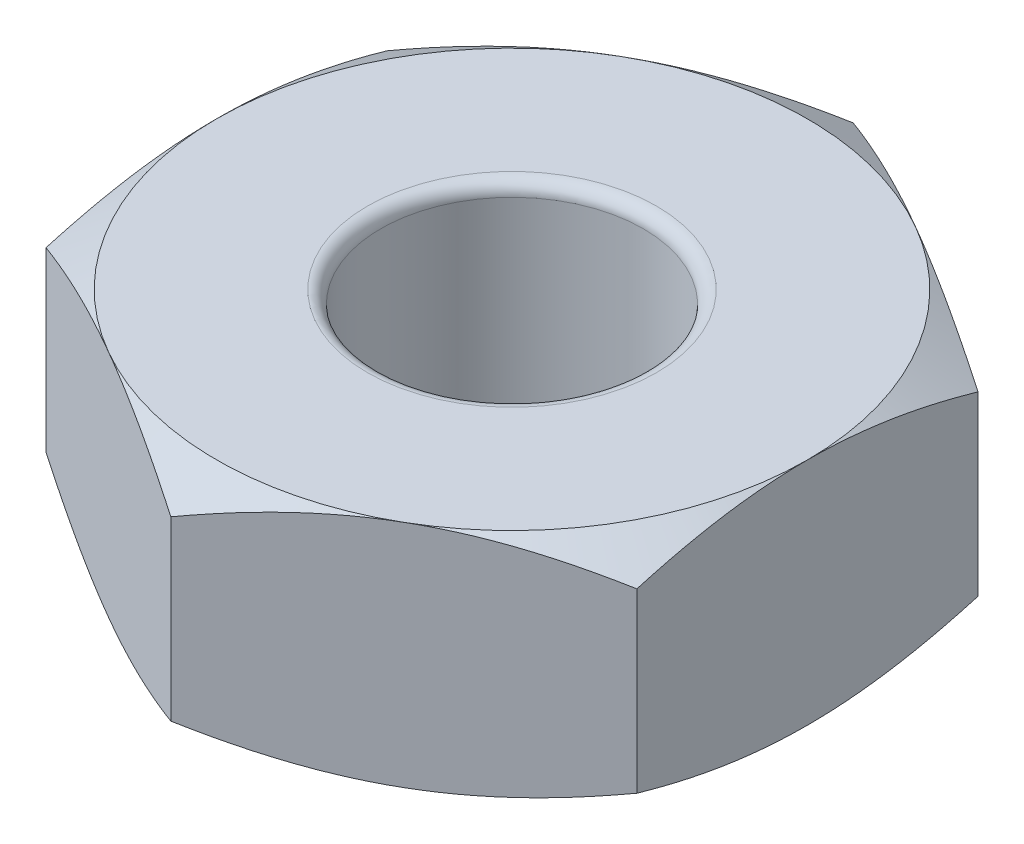
ISO-10303-21;
HEADER;
FILE_DESCRIPTION(('STEP AP214'),'2;1');
FILE_NAME('part.step','',(''),(''),'','','');
FILE_SCHEMA(('AUTOMOTIVE_DESIGN { 1 0 10303 214 1 1 1 1 }'));
ENDSEC;
DATA;
#1=APPLICATION_CONTEXT('core data for automotive mechanical design processes');
#2=APPLICATION_PROTOCOL_DEFINITION('international standard','automotive_design',2000,#1);
#3=PRODUCT_CONTEXT('',#1,'mechanical');
#4=PRODUCT('Part','Part','',(#3));
#5=PRODUCT_RELATED_PRODUCT_CATEGORY('part','',(#4));
#6=PRODUCT_DEFINITION_FORMATION('','',#4);
#7=PRODUCT_DEFINITION_CONTEXT('part definition',#1,'design');
#8=PRODUCT_DEFINITION('design','',#6,#7);
#9=PRODUCT_DEFINITION_SHAPE('','',#8);
#10=(LENGTH_UNIT() NAMED_UNIT(*) SI_UNIT(.MILLI.,.METRE.));
#11=(NAMED_UNIT(*) PLANE_ANGLE_UNIT() SI_UNIT($,.RADIAN.));
#12=(NAMED_UNIT(*) SI_UNIT($,.STERADIAN.) SOLID_ANGLE_UNIT());
#13=UNCERTAINTY_MEASURE_WITH_UNIT(LENGTH_MEASURE(1.E-05),#10,'distance_accuracy_value','');
#14=(GEOMETRIC_REPRESENTATION_CONTEXT(3) GLOBAL_UNCERTAINTY_ASSIGNED_CONTEXT((#13)) GLOBAL_UNIT_ASSIGNED_CONTEXT((#10,
#11,#12)) REPRESENTATION_CONTEXT('',''));
#15=CARTESIAN_POINT('',(0.,0.,0.));
#16=DIRECTION('',(0.,0.,1.));
#17=DIRECTION('',(1.,0.,0.));
#18=AXIS2_PLACEMENT_3D('',#15,#16,#17);
#19=CARTESIAN_POINT('',(-2.25,1.75,1.29903810567666));
#20=DIRECTION('',(0.5,0.,-0.866025403784439));
#21=DIRECTION('',(-0.866025403784439,0.,-0.5));
#22=AXIS2_PLACEMENT_3D('',#19,#20,#21);
#23=PLANE('',#22);
#24=CARTESIAN_POINT('',(0.000200000000000215,0.201028565434254,2.59819168140715));
#25=CARTESIAN_POINT('',(-0.098677248814357,0.168055578047863,2.54110487518745));
#26=CARTESIAN_POINT('',(-0.198407997179093,0.138067535415597,2.48352530077259));
#27=CARTESIAN_POINT('',(-0.399596540220632,0.0857223882308777,2.36736904128969));
#28=CARTESIAN_POINT('',(-0.501057910502945,0.0633838027064786,2.30879029184485));
#29=CARTESIAN_POINT('',(-0.702723189801079,0.0286095576734188,2.19235878855587));
#30=CARTESIAN_POINT('',(-0.802896064976672,0.0159424738337181,2.13452395210774));
#31=CARTESIAN_POINT('',(-1.00371331260268,0.000818907417418613,2.01858206013295));
#32=CARTESIAN_POINT('',(-1.1043569548332,-0.00165009697600163,1.96047542619893));
#33=CARTESIAN_POINT('',(-1.29242516452656,0.00347837463602931,1.85189419470646));
#34=CARTESIAN_POINT('',(-1.37987784389126,0.00981663451512034,1.8014033667339));
#35=CARTESIAN_POINT('',(-1.55421343210877,0.029907657189889,1.70075066794718));
#36=CARTESIAN_POINT('',(-1.64109573768829,0.0436672872310834,1.65058914543304));
#37=CARTESIAN_POINT('',(-1.81579095410174,0.0780662653506653,1.54972881521059));
#38=CARTESIAN_POINT('',(-1.90358174743525,0.0988514715826554,1.49904277704711));
#39=CARTESIAN_POINT('',(-2.07785373687759,0.146026087362979,1.39842679703037));
#40=CARTESIAN_POINT('',(-2.164337166751,0.172404408014302,1.34849556551251));
#41=CARTESIAN_POINT('',(-2.2502,0.201028565434254,1.29892263562282));
#42=B_SPLINE_CURVE_WITH_KNOTS('',3,(#24,#25,#26,#27,#28,#29,#30,#31,#32,#33,#34,#35,#36,#37,#38,
#39,#40,#41),.UNSPECIFIED.,.F.,.F.,(4,2,2,2,2,2,2,2,4),(0.,0.356658826016552,0.714175103224236,
1.06284241804968,1.41108149062516,1.71433394539794,2.01786749258222,2.32813511279245,
2.63779325460359),.UNSPECIFIED.);
#43=CARTESIAN_POINT('',(0.,0.200961894323341,2.59807621135332));
#44=VERTEX_POINT('',#43);
#45=CARTESIAN_POINT('',(-1.125,0.,1.94855715851499));
#46=VERTEX_POINT('',#45);
#47=EDGE_CURVE('E149',#44,#46,#42,.T.);
#48=ORIENTED_EDGE('',*,*,#47,.F.);
#49=DIRECTION('',(0.,-1.,0.));
#50=VECTOR('',#49,1.);
#51=CARTESIAN_POINT('',(0.,1.75,2.59807621135332));
#52=LINE('',#51,#50);
#53=CARTESIAN_POINT('',(0.,1.54903810567666,2.59807621135332));
#54=VERTEX_POINT('',#53);
#55=EDGE_CURVE('E164',#54,#44,#52,.T.);
#56=ORIENTED_EDGE('',*,*,#55,.F.);
#57=CARTESIAN_POINT('',(-2.2502,1.54897143456575,1.29892263562282));
#58=CARTESIAN_POINT('',(-2.15132275118564,1.58194442195214,1.35600944184252));
#59=CARTESIAN_POINT('',(-2.05159200282091,1.6119324645844,1.41358901625738));
#60=CARTESIAN_POINT('',(-1.85040345977937,1.66427761176912,1.52974527574028));
#61=CARTESIAN_POINT('',(-1.74894208949705,1.68661619729352,1.58832402518512));
#62=CARTESIAN_POINT('',(-1.54727681019892,1.72139044232658,1.7047555284741));
#63=CARTESIAN_POINT('',(-1.44710393502333,1.73405752616628,1.76259036492223));
#64=CARTESIAN_POINT('',(-1.24628668739732,1.74918109258258,1.87853225689702));
#65=CARTESIAN_POINT('',(-1.1456430451668,1.751650096976,1.93663889083104));
#66=CARTESIAN_POINT('',(-0.957574835473435,1.74652162536397,2.04522012232352));
#67=CARTESIAN_POINT('',(-0.870122156108742,1.74018336548488,2.09571095029608));
#68=CARTESIAN_POINT('',(-0.695786567891226,1.72009234281011,2.19636364908279));
#69=CARTESIAN_POINT('',(-0.608904262311712,1.70633271276892,2.24652517159694));
#70=CARTESIAN_POINT('',(-0.434209045898264,1.67193373464934,2.34738550181938));
#71=CARTESIAN_POINT('',(-0.346418252564747,1.65114852841734,2.39807153998286));
#72=CARTESIAN_POINT('',(-0.172146263122405,1.60397391263702,2.49868751999961));
#73=CARTESIAN_POINT('',(-0.0856628332489978,1.5775955919857,2.54861875151746));
#74=CARTESIAN_POINT('',(0.00020000000000027,1.54897143456575,2.59819168140715));
#75=B_SPLINE_CURVE_WITH_KNOTS('',3,(#57,#58,#59,#60,#61,#62,#63,#64,#65,#66,#67,#68,#69,#70,#71,
#72,#73,#74),.UNSPECIFIED.,.F.,.F.,(4,2,2,2,2,2,2,2,4),(0.,0.356658826016552,0.714175103224236,
1.06284241804968,1.41108149062516,1.71433394539794,2.01786749258222,2.32813511279245,
2.63779325460359),.UNSPECIFIED.);
#76=CARTESIAN_POINT('',(-1.125,1.75,1.94855715851499));
#77=VERTEX_POINT('',#76);
#78=EDGE_CURVE('E228',#77,#54,#75,.T.);
#79=ORIENTED_EDGE('',*,*,#78,.F.);
#80=CARTESIAN_POINT('',(-2.25,1.54903810567666,1.29903810567667));
#81=VERTEX_POINT('',#80);
#82=EDGE_CURVE('E235',#81,#77,#75,.T.);
#83=ORIENTED_EDGE('',*,*,#82,.F.);
#84=DIRECTION('',(0.,-1.,0.));
#85=VECTOR('',#84,1.);
#86=CARTESIAN_POINT('',(-2.25,1.75,1.29903810567666));
#87=LINE('',#86,#85);
#88=CARTESIAN_POINT('',(-2.25,0.200961894323341,1.29903810567666));
#89=VERTEX_POINT('',#88);
#90=EDGE_CURVE('E243',#81,#89,#87,.T.);
#91=ORIENTED_EDGE('',*,*,#90,.T.);
#92=EDGE_CURVE('E217',#46,#89,#42,.T.);
#93=ORIENTED_EDGE('',*,*,#92,.F.);
#94=EDGE_LOOP('',(#48,#56,#79,#83,#91,#93));
#95=FACE_BOUND('',#94,.T.);
#96=ADVANCED_FACE('F39',(#95),#23,.F.);
#97=CARTESIAN_POINT('',(0.,1.75,2.59807621135332));
#98=DIRECTION('',(-0.5,0.,-0.866025403784439));
#99=DIRECTION('',(-0.866025403784439,0.,0.5));
#100=AXIS2_PLACEMENT_3D('',#97,#98,#99);
#101=PLANE('',#100);
#102=CARTESIAN_POINT('',(2.2502,0.201028565434254,1.29892263562282));
#103=CARTESIAN_POINT('',(2.15132275118564,0.168055578047864,1.35600944184252));
#104=CARTESIAN_POINT('',(2.05159200282091,0.138067535415598,1.41358901625738));
#105=CARTESIAN_POINT('',(1.85040345977937,0.0857223882308779,1.52974527574028));
#106=CARTESIAN_POINT('',(1.74894208949705,0.0633838027064785,1.58832402518512));
#107=CARTESIAN_POINT('',(1.54727681019892,0.0286095576734187,1.7047555284741));
#108=CARTESIAN_POINT('',(1.44710393502333,0.0159424738337183,1.76259036492223));
#109=CARTESIAN_POINT('',(1.24628668739732,0.000818907417418955,1.87853225689702));
#110=CARTESIAN_POINT('',(1.1456430451668,-0.00165009697600138,1.93663889083104));
#111=CARTESIAN_POINT('',(0.957574835473435,0.00347837463602933,2.04522012232352));
#112=CARTESIAN_POINT('',(0.870122156108742,0.00981663451512025,2.09571095029608));
#113=CARTESIAN_POINT('',(0.695786567891226,0.0299076571898889,2.19636364908279));
#114=CARTESIAN_POINT('',(0.608904262311712,0.0436672872310835,2.24652517159694));
#115=CARTESIAN_POINT('',(0.434209045898264,0.0780662653506654,2.34738550181938));
#116=CARTESIAN_POINT('',(0.346418252564747,0.0988514715826554,2.39807153998286));
#117=CARTESIAN_POINT('',(0.172146263122405,0.146026087362979,2.49868751999961));
#118=CARTESIAN_POINT('',(0.0856628332489976,0.172404408014302,2.54861875151746));
#119=CARTESIAN_POINT('',(-0.000199999999999876,0.201028565434255,2.59819168140715));
#120=B_SPLINE_CURVE_WITH_KNOTS('',3,(#102,#103,#104,#105,#106,#107,#108,#109,#110,#111,#112,
#113,#114,#115,#116,#117,#118,#119),.UNSPECIFIED.,.F.,.F.,(4,2,2,2,2,2,2,2,4),(0.,
0.356658826016552,0.714175103224236,1.06284241804968,1.41108149062516,1.71433394539794,
2.01786749258222,2.32813511279245,2.63779325460359),.UNSPECIFIED.);
#121=CARTESIAN_POINT('',(2.25,0.200961894323341,1.29903810567666));
#122=VERTEX_POINT('',#121);
#123=CARTESIAN_POINT('',(1.125,0.,1.94855715851499));
#124=VERTEX_POINT('',#123);
#125=EDGE_CURVE('E128',#122,#124,#120,.T.);
#126=ORIENTED_EDGE('',*,*,#125,.F.);
#127=DIRECTION('',(0.,-1.,0.));
#128=VECTOR('',#127,1.);
#129=CARTESIAN_POINT('',(2.25,1.75,1.29903810567666));
#130=LINE('',#129,#128);
#131=CARTESIAN_POINT('',(2.25,1.54903810567666,1.29903810567666));
#132=VERTEX_POINT('',#131);
#133=EDGE_CURVE('E255',#132,#122,#130,.T.);
#134=ORIENTED_EDGE('',*,*,#133,.F.);
#135=CARTESIAN_POINT('',(-0.000199999999999816,1.54897143456575,2.59819168140715));
#136=CARTESIAN_POINT('',(0.0986772488143575,1.58194442195214,2.54110487518745));
#137=CARTESIAN_POINT('',(0.198407997179094,1.6119324645844,2.48352530077259));
#138=CARTESIAN_POINT('',(0.399596540220633,1.66427761176912,2.36736904128969));
#139=CARTESIAN_POINT('',(0.501057910502946,1.68661619729352,2.30879029184485));
#140=CARTESIAN_POINT('',(0.702723189801079,1.72139044232658,2.19235878855587));
#141=CARTESIAN_POINT('',(0.802896064976672,1.73405752616628,2.13452395210774));
#142=CARTESIAN_POINT('',(1.00371331260268,1.74918109258258,2.01858206013295));
#143=CARTESIAN_POINT('',(1.1043569548332,1.751650096976,1.96047542619893));
#144=CARTESIAN_POINT('',(1.29242516452656,1.74652162536397,1.85189419470646));
#145=CARTESIAN_POINT('',(1.37987784389126,1.74018336548488,1.8014033667339));
#146=CARTESIAN_POINT('',(1.55421343210877,1.72009234281011,1.70075066794718));
#147=CARTESIAN_POINT('',(1.64109573768829,1.70633271276892,1.65058914543304));
#148=CARTESIAN_POINT('',(1.81579095410174,1.67193373464933,1.54972881521059));
#149=CARTESIAN_POINT('',(1.90358174743525,1.65114852841734,1.49904277704711));
#150=CARTESIAN_POINT('',(2.07785373687759,1.60397391263702,1.39842679703037));
#151=CARTESIAN_POINT('',(2.164337166751,1.5775955919857,1.34849556551251));
#152=CARTESIAN_POINT('',(2.2502,1.54897143456575,1.29892263562282));
#153=B_SPLINE_CURVE_WITH_KNOTS('',3,(#135,#136,#137,#138,#139,#140,#141,#142,#143,#144,#145,
#146,#147,#148,#149,#150,#151,#152),.UNSPECIFIED.,.F.,.F.,(4,2,2,2,2,2,2,2,4),(0.,
0.356658826016552,0.714175103224236,1.06284241804968,1.41108149062516,1.71433394539794,
2.01786749258222,2.32813511279245,2.63779325460359),.UNSPECIFIED.);
#154=CARTESIAN_POINT('',(1.125,1.75,1.94855715851499));
#155=VERTEX_POINT('',#154);
#156=EDGE_CURVE('E237',#155,#132,#153,.T.);
#157=ORIENTED_EDGE('',*,*,#156,.F.);
#158=EDGE_CURVE('E236',#54,#155,#153,.T.);
#159=ORIENTED_EDGE('',*,*,#158,.F.);
#160=ORIENTED_EDGE('',*,*,#55,.T.);
#161=EDGE_CURVE('E141',#124,#44,#120,.T.);
#162=ORIENTED_EDGE('',*,*,#161,.F.);
#163=EDGE_LOOP('',(#126,#134,#157,#159,#160,#162));
#164=FACE_BOUND('',#163,.T.);
#165=ADVANCED_FACE('F161',(#164),#101,.F.);
#166=CARTESIAN_POINT('',(2.25,1.75,1.29903810567666));
#167=DIRECTION('',(-1.,0.,0.));
#168=DIRECTION('',(0.,0.,1.));
#169=AXIS2_PLACEMENT_3D('',#166,#167,#168);
#170=PLANE('',#169);
#171=CARTESIAN_POINT('',(2.25,1.56555831138049,-4.42213047046897));
#172=CARTESIAN_POINT('',(2.25,1.51253641089187,-4.31907609605377));
#173=CARTESIAN_POINT('',(2.25,1.45980461522268,-4.21587114895435));
#174=CARTESIAN_POINT('',(2.25,1.35506687206804,-4.00909136564838));
#175=CARTESIAN_POINT('',(2.25,1.30306093826251,-3.90551652251669));
#176=CARTESIAN_POINT('',(2.25,1.19983819414006,-3.69776226755876));
#177=CARTESIAN_POINT('',(2.25,1.14862281407765,-3.59358214386062));
#178=CARTESIAN_POINT('',(2.25,1.04726863927474,-3.38469686395628));
#179=CARTESIAN_POINT('',(2.25,0.997129859883961,-3.27999170029052));
#180=CARTESIAN_POINT('',(2.25,0.895590975392254,-3.06443773664851));
#181=CARTESIAN_POINT('',(2.25,0.844262813896654,-2.95355495083985));
#182=CARTESIAN_POINT('',(2.25,0.743488704008481,-2.73093810810308));
#183=CARTESIAN_POINT('',(2.25,0.694042704613714,-2.6192040743404));
#184=CARTESIAN_POINT('',(2.25,0.597606517380621,-2.39476559407176));
#185=CARTESIAN_POINT('',(2.25,0.550614681662905,-2.28206185948416));
#186=CARTESIAN_POINT('',(2.25,0.459779963230871,-2.05535508627361));
#187=CARTESIAN_POINT('',(2.25,0.415937817282043,-1.94135175083155));
#188=CARTESIAN_POINT('',(2.25,0.325629065729293,-1.69318584033386));
#189=CARTESIAN_POINT('',(2.25,0.279891243493501,-1.55875423344575));
#190=CARTESIAN_POINT('',(2.25,0.196186335346582,-1.28751781965287));
#191=CARTESIAN_POINT('',(2.25,0.158215303092898,-1.15071425647396));
#192=CARTESIAN_POINT('',(2.25,0.0934100246854135,-0.877191892519575));
#193=CARTESIAN_POINT('',(2.25,0.0663767276583866,-0.740521481245889));
#194=CARTESIAN_POINT('',(2.25,0.0252694807344891,-0.465223193243969));
#195=CARTESIAN_POINT('',(2.25,0.0111879530299645,-0.326596509361764));
#196=CARTESIAN_POINT('',(2.25,0.00112514059449637,-0.117223951792124));
#197=CARTESIAN_POINT('',(2.25,-0.000357653579398874,-0.0467155663666333));
#198=CARTESIAN_POINT('',(2.25,0.000502767822567108,0.0942778450423075));
#199=CARTESIAN_POINT('',(2.25,0.00284598504344001,0.164762871015701));
#200=CARTESIAN_POINT('',(2.25,0.0155320953718861,0.375901114139416));
#201=CARTESIAN_POINT('',(2.25,0.0315313215434617,0.516240180351075));
#202=CARTESIAN_POINT('',(2.25,0.076927586603595,0.7975364312409));
#203=CARTESIAN_POINT('',(2.25,0.106589144783226,0.938448674669498));
#204=CARTESIAN_POINT('',(2.25,0.176240629866023,1.21767236088611));
#205=CARTESIAN_POINT('',(2.25,0.216233678272229,1.35598300406735));
#206=CARTESIAN_POINT('',(2.25,0.301848870671621,1.62417819674141));
#207=CARTESIAN_POINT('',(2.25,0.34714996058763,1.75416736002763));
#208=CARTESIAN_POINT('',(2.25,0.44280152310107,2.01228919589808));
#209=CARTESIAN_POINT('',(2.25,0.493153199709669,2.14042141743363));
#210=CARTESIAN_POINT('',(2.25,0.597611255264981,2.39528540480934));
#211=CARTESIAN_POINT('',(2.25,0.651721394221922,2.52201561679053));
#212=CARTESIAN_POINT('',(2.25,0.762705830640598,2.77426151692868));
#213=CARTESIAN_POINT('',(2.25,0.819580277044825,2.89977713920496));
#214=CARTESIAN_POINT('',(2.25,0.932150499113663,3.14277870156181));
#215=CARTESIAN_POINT('',(2.25,0.987731600848741,3.26031797968368));
#216=CARTESIAN_POINT('',(2.25,1.10035122751633,3.49469938792213));
#217=CARTESIAN_POINT('',(2.25,1.15738979940018,3.61154149542992));
#218=CARTESIAN_POINT('',(2.25,1.27243073348914,3.84427750639044));
#219=CARTESIAN_POINT('',(2.25,1.33042936901701,3.96017325620988));
#220=CARTESIAN_POINT('',(2.25,1.44735195230743,4.19148501960205));
#221=CARTESIAN_POINT('',(2.25,1.5062758208671,4.30690107318009));
#222=CARTESIAN_POINT('',(2.25,1.56555831138049,4.42213047046896));
#223=B_SPLINE_CURVE_WITH_KNOTS('',3,(#171,#172,#173,#174,#175,#176,#177,#178,#179,#180,#181,
#182,#183,#184,#185,#186,#187,#188,#189,#190,#191,#192,#193,#194,#195,#196,#197,#198,#199,#200,
#201,#202,#203,#204,#205,#206,#207,#208,#209,#210,#211,#212,#213,#214,#215,#216,#217,#218,#219,
#220,#221,#222),.UNSPECIFIED.,.F.,.F.,(4,2,2,2,2,2,2,2,2,2,2,2,2,2,2,2,2,2,2,2,2,2,2,2,2,4),(0.,
0.347684660648864,0.695375865091879,1.04363591220691,1.39190092137216,1.75844707629514,
2.12498329159302,2.4912701408257,2.85764239361152,3.28347290105065,3.70908650157083,
4.12656251242164,4.54379411118024,4.75527202620087,4.96675003214744,5.38969802732589,
5.82120323135264,6.25283896092085,6.66567429964863,7.07860828930034,7.49196150428248,
7.90533701571904,8.29537955819919,8.68543468149341,9.07422449696778,9.46298121030578),.UNSPECIFIED.);
#224=CARTESIAN_POINT('',(2.25,0.200961894323341,-1.29903810567666));
#225=VERTEX_POINT('',#224);
#226=CARTESIAN_POINT('',(2.25,0.,0.));
#227=VERTEX_POINT('',#226);
#228=EDGE_CURVE('E54',#225,#227,#223,.T.);
#229=ORIENTED_EDGE('',*,*,#228,.F.);
#230=DIRECTION('',(0.,-1.,0.));
#231=VECTOR('',#230,1.);
#232=CARTESIAN_POINT('',(2.25,1.75,-1.29903810567666));
#233=LINE('',#232,#231);
#234=CARTESIAN_POINT('',(2.25,1.54903810567666,-1.29903810567666));
#235=VERTEX_POINT('',#234);
#236=EDGE_CURVE('E252',#235,#225,#233,.T.);
#237=ORIENTED_EDGE('',*,*,#236,.F.);
#238=CARTESIAN_POINT('',(2.25,0.184441688619512,4.42213047046896));
#239=CARTESIAN_POINT('',(2.25,0.237463589108126,4.31907609605376));
#240=CARTESIAN_POINT('',(2.25,0.29019538477732,4.21587114895434));
#241=CARTESIAN_POINT('',(2.25,0.394933127931959,4.00909136564838));
#242=CARTESIAN_POINT('',(2.25,0.446939061737493,3.90551652251669));
#243=CARTESIAN_POINT('',(2.25,0.550161805859938,3.69776226755876));
#244=CARTESIAN_POINT('',(2.25,0.601377185922349,3.59358214386062));
#245=CARTESIAN_POINT('',(2.25,0.702731360725256,3.38469686395628));
#246=CARTESIAN_POINT('',(2.25,0.75287014011604,3.27999170029052));
#247=CARTESIAN_POINT('',(2.25,0.854409024607746,3.06443773664851));
#248=CARTESIAN_POINT('',(2.25,0.905737186103346,2.95355495083985));
#249=CARTESIAN_POINT('',(2.25,1.00651129599152,2.73093810810308));
#250=CARTESIAN_POINT('',(2.25,1.05595729538629,2.6192040743404));
#251=CARTESIAN_POINT('',(2.25,1.15239348261938,2.39476559407176));
#252=CARTESIAN_POINT('',(2.25,1.19938531833709,2.28206185948416));
#253=CARTESIAN_POINT('',(2.25,1.29022003676913,2.05535508627361));
#254=CARTESIAN_POINT('',(2.25,1.33406218271796,1.94135175083155));
#255=CARTESIAN_POINT('',(2.25,1.42437093427071,1.69318584033386));
#256=CARTESIAN_POINT('',(2.25,1.4701087565065,1.55875423344575));
#257=CARTESIAN_POINT('',(2.25,1.55381366465342,1.28751781965287));
#258=CARTESIAN_POINT('',(2.25,1.5917846969071,1.15071425647396));
#259=CARTESIAN_POINT('',(2.25,1.65658997531459,0.877191892519575));
#260=CARTESIAN_POINT('',(2.25,1.68362327234161,0.74052148124589));
#261=CARTESIAN_POINT('',(2.25,1.72473051926551,0.465223193243969));
#262=CARTESIAN_POINT('',(2.25,1.73881204697004,0.326596509361764));
#263=CARTESIAN_POINT('',(2.25,1.7488748594055,0.117223951792124));
#264=CARTESIAN_POINT('',(2.25,1.7503576535794,0.0467155663666339));
#265=CARTESIAN_POINT('',(2.25,1.74949723217743,-0.0942778450423072));
#266=CARTESIAN_POINT('',(2.25,1.74715401495656,-0.164762871015701));
#267=CARTESIAN_POINT('',(2.25,1.73446790462811,-0.375901114139416));
#268=CARTESIAN_POINT('',(2.25,1.71846867845654,-0.516240180351075));
#269=CARTESIAN_POINT('',(2.25,1.67307241339641,-0.797536431240899));
#270=CARTESIAN_POINT('',(2.25,1.64341085521677,-0.938448674669497));
#271=CARTESIAN_POINT('',(2.25,1.57375937013398,-1.21767236088611));
#272=CARTESIAN_POINT('',(2.25,1.53376632172777,-1.35598300406735));
#273=CARTESIAN_POINT('',(2.25,1.44815112932838,-1.62417819674141));
#274=CARTESIAN_POINT('',(2.25,1.40285003941237,-1.75416736002763));
#275=CARTESIAN_POINT('',(2.25,1.30719847689893,-2.01228919589808));
#276=CARTESIAN_POINT('',(2.25,1.25684680029033,-2.14042141743363));
#277=CARTESIAN_POINT('',(2.25,1.15238874473502,-2.39528540480934));
#278=CARTESIAN_POINT('',(2.25,1.09827860577808,-2.52201561679053));
#279=CARTESIAN_POINT('',(2.25,0.987294169359401,-2.77426151692868));
#280=CARTESIAN_POINT('',(2.25,0.930419722955175,-2.89977713920496));
#281=CARTESIAN_POINT('',(2.25,0.817849500886336,-3.14277870156182));
#282=CARTESIAN_POINT('',(2.25,0.762268399151258,-3.26031797968369));
#283=CARTESIAN_POINT('',(2.25,0.649648772483665,-3.49469938792213));
#284=CARTESIAN_POINT('',(2.25,0.592610200599821,-3.61154149542992));
#285=CARTESIAN_POINT('',(2.25,0.477569266510853,-3.84427750639044));
#286=CARTESIAN_POINT('',(2.25,0.419570630982987,-3.96017325620989));
#287=CARTESIAN_POINT('',(2.25,0.30264804769257,-4.19148501960206));
#288=CARTESIAN_POINT('',(2.25,0.243724179132899,-4.30690107318009));
#289=CARTESIAN_POINT('',(2.25,0.184441688619511,-4.42213047046897));
#290=B_SPLINE_CURVE_WITH_KNOTS('',3,(#238,#239,#240,#241,#242,#243,#244,#245,#246,#247,#248,
#249,#250,#251,#252,#253,#254,#255,#256,#257,#258,#259,#260,#261,#262,#263,#264,#265,#266,#267,
#268,#269,#270,#271,#272,#273,#274,#275,#276,#277,#278,#279,#280,#281,#282,#283,#284,#285,#286,
#287,#288,#289),.UNSPECIFIED.,.F.,.F.,(4,2,2,2,2,2,2,2,2,2,2,2,2,2,2,2,2,2,2,2,2,2,2,2,2,4),(0.,
0.347684660648864,0.695375865091878,1.04363591220691,1.39190092137216,1.75844707629514,
2.12498329159302,2.4912701408257,2.85764239361152,3.28347290105065,3.70908650157083,
4.12656251242163,4.54379411118024,4.75527202620086,4.96675003214743,5.38969802732589,
5.82120323135264,6.25283896092085,6.66567429964862,7.07860828930034,7.49196150428248,
7.90533701571904,8.29537955819919,8.68543468149341,9.07422449696779,9.46298121030578),.UNSPECIFIED.);
#291=CARTESIAN_POINT('',(2.25,1.75,0.));
#292=VERTEX_POINT('',#291);
#293=EDGE_CURVE('E293',#292,#235,#290,.T.);
#294=ORIENTED_EDGE('',*,*,#293,.F.);
#295=EDGE_CURVE('E298',#132,#292,#290,.T.);
#296=ORIENTED_EDGE('',*,*,#295,.F.);
#297=ORIENTED_EDGE('',*,*,#133,.T.);
#298=EDGE_CURVE('E135',#227,#122,#223,.T.);
#299=ORIENTED_EDGE('',*,*,#298,.F.);
#300=EDGE_LOOP('',(#229,#237,#294,#296,#297,#299));
#301=FACE_BOUND('',#300,.T.);
#302=ADVANCED_FACE('F299',(#301),#170,.F.);
#303=CARTESIAN_POINT('',(2.25,1.75,-1.29903810567666));
#304=DIRECTION('',(-0.5,0.,0.866025403784439));
#305=DIRECTION('',(0.866025403784439,0.,0.5));
#306=AXIS2_PLACEMENT_3D('',#303,#304,#305);
#307=PLANE('',#306);
#308=CARTESIAN_POINT('',(-0.000200000000000678,0.201028565434254,-2.59819168140715));
#309=CARTESIAN_POINT('',(0.0986772488143565,0.168055578047863,-2.54110487518745));
#310=CARTESIAN_POINT('',(0.198407997179093,0.138067535415597,-2.48352530077259));
#311=CARTESIAN_POINT('',(0.399596540220632,0.0857223882308776,-2.36736904128969));
#312=CARTESIAN_POINT('',(0.501057910502945,0.0633838027064785,-2.30879029184485));
#313=CARTESIAN_POINT('',(0.702723189801078,0.0286095576734188,-2.19235878855587));
#314=CARTESIAN_POINT('',(0.802896064976671,0.0159424738337183,-2.13452395210774));
#315=CARTESIAN_POINT('',(1.00371331260268,0.000818907417418693,-2.01858206013295));
#316=CARTESIAN_POINT('',(1.1043569548332,-0.00165009697600181,-1.96047542619893));
#317=CARTESIAN_POINT('',(1.29242516452656,0.003478374636029,-1.85189419470646));
#318=CARTESIAN_POINT('',(1.37987784389126,0.00981663451512011,-1.8014033667339));
#319=CARTESIAN_POINT('',(1.55421343210877,0.0299076571898889,-1.70075066794718));
#320=CARTESIAN_POINT('',(1.64109573768829,0.0436672872310833,-1.65058914543304));
#321=CARTESIAN_POINT('',(1.81579095410174,0.0780662653506653,-1.54972881521059));
#322=CARTESIAN_POINT('',(1.90358174743525,0.0988514715826554,-1.49904277704711));
#323=CARTESIAN_POINT('',(2.07785373687759,0.146026087362979,-1.39842679703037));
#324=CARTESIAN_POINT('',(2.164337166751,0.172404408014302,-1.34849556551251));
#325=CARTESIAN_POINT('',(2.2502,0.201028565434254,-1.29892263562282));
#326=B_SPLINE_CURVE_WITH_KNOTS('',3,(#308,#309,#310,#311,#312,#313,#314,#315,#316,#317,#318,
#319,#320,#321,#322,#323,#324,#325),.UNSPECIFIED.,.F.,.F.,(4,2,2,2,2,2,2,2,4),(0.,
0.356658826016552,0.714175103224236,1.06284241804968,1.41108149062516,1.71433394539794,
2.01786749258222,2.32813511279245,2.63779325460359),.UNSPECIFIED.);
#327=CARTESIAN_POINT('',(0.,0.200961894323341,-2.59807621135332));
#328=VERTEX_POINT('',#327);
#329=CARTESIAN_POINT('',(1.125,0.,-1.94855715851499));
#330=VERTEX_POINT('',#329);
#331=EDGE_CURVE('E62',#328,#330,#326,.T.);
#332=ORIENTED_EDGE('',*,*,#331,.F.);
#333=DIRECTION('',(0.,-1.,0.));
#334=VECTOR('',#333,1.);
#335=CARTESIAN_POINT('',(0.,1.75,-2.59807621135332));
#336=LINE('',#335,#334);
#337=CARTESIAN_POINT('',(0.,1.54903810567666,-2.59807621135332));
#338=VERTEX_POINT('',#337);
#339=EDGE_CURVE('E249',#338,#328,#336,.T.);
#340=ORIENTED_EDGE('',*,*,#339,.F.);
#341=CARTESIAN_POINT('',(2.2502,1.54897143456575,-1.29892263562282));
#342=CARTESIAN_POINT('',(2.15132275118564,1.58194442195214,-1.35600944184252));
#343=CARTESIAN_POINT('',(2.05159200282091,1.6119324645844,-1.41358901625738));
#344=CARTESIAN_POINT('',(1.85040345977937,1.66427761176912,-1.52974527574028));
#345=CARTESIAN_POINT('',(1.74894208949705,1.68661619729352,-1.58832402518513));
#346=CARTESIAN_POINT('',(1.54727681019892,1.72139044232658,-1.7047555284741));
#347=CARTESIAN_POINT('',(1.44710393502333,1.73405752616628,-1.76259036492223));
#348=CARTESIAN_POINT('',(1.24628668739732,1.74918109258258,-1.87853225689702));
#349=CARTESIAN_POINT('',(1.1456430451668,1.751650096976,-1.93663889083104));
#350=CARTESIAN_POINT('',(0.957574835473434,1.74652162536397,-2.04522012232352));
#351=CARTESIAN_POINT('',(0.870122156108741,1.74018336548488,-2.09571095029608));
#352=CARTESIAN_POINT('',(0.695786567891225,1.72009234281011,-2.19636364908279));
#353=CARTESIAN_POINT('',(0.608904262311711,1.70633271276892,-2.24652517159694));
#354=CARTESIAN_POINT('',(0.434209045898264,1.67193373464933,-2.34738550181938));
#355=CARTESIAN_POINT('',(0.346418252564746,1.65114852841735,-2.39807153998286));
#356=CARTESIAN_POINT('',(0.172146263122404,1.60397391263702,-2.49868751999961));
#357=CARTESIAN_POINT('',(0.0856628332489969,1.5775955919857,-2.54861875151746));
#358=CARTESIAN_POINT('',(-0.000200000000000705,1.54897143456575,-2.59819168140715));
#359=B_SPLINE_CURVE_WITH_KNOTS('',3,(#341,#342,#343,#344,#345,#346,#347,#348,#349,#350,#351,
#352,#353,#354,#355,#356,#357,#358),.UNSPECIFIED.,.F.,.F.,(4,2,2,2,2,2,2,2,4),(0.,
0.356658826016552,0.714175103224236,1.06284241804968,1.41108149062516,1.71433394539794,
2.01786749258222,2.32813511279245,2.63779325460359),.UNSPECIFIED.);
#360=CARTESIAN_POINT('',(1.125,1.75,-1.94855715851499));
#361=VERTEX_POINT('',#360);
#362=EDGE_CURVE('E287',#361,#338,#359,.T.);
#363=ORIENTED_EDGE('',*,*,#362,.F.);
#364=EDGE_CURVE('E292',#235,#361,#359,.T.);
#365=ORIENTED_EDGE('',*,*,#364,.F.);
#366=ORIENTED_EDGE('',*,*,#236,.T.);
#367=EDGE_CURVE('E140',#330,#225,#326,.T.);
#368=ORIENTED_EDGE('',*,*,#367,.F.);
#369=EDGE_LOOP('',(#332,#340,#363,#365,#366,#368));
#370=FACE_BOUND('',#369,.T.);
#371=ADVANCED_FACE('F274',(#370),#307,.F.);
#372=CARTESIAN_POINT('',(0.,1.75,-2.59807621135332));
#373=DIRECTION('',(0.5,0.,0.866025403784439));
#374=DIRECTION('',(0.866025403784439,0.,-0.5));
#375=AXIS2_PLACEMENT_3D('',#372,#373,#374);
#376=PLANE('',#375);
#377=CARTESIAN_POINT('',(-2.2502,0.201028565434255,-1.29892263562282));
#378=CARTESIAN_POINT('',(-2.15132275118564,0.168055578047864,-1.35600944184252));
#379=CARTESIAN_POINT('',(-2.05159200282091,0.138067535415598,-1.41358901625738));
#380=CARTESIAN_POINT('',(-1.85040345977937,0.0857223882308779,-1.52974527574028));
#381=CARTESIAN_POINT('',(-1.74894208949705,0.0633838027064785,-1.58832402518512));
#382=CARTESIAN_POINT('',(-1.54727681019892,0.0286095576734186,-1.7047555284741));
#383=CARTESIAN_POINT('',(-1.44710393502333,0.0159424738337182,-1.76259036492223));
#384=CARTESIAN_POINT('',(-1.24628668739732,0.000818907417418896,-1.87853225689702));
#385=CARTESIAN_POINT('',(-1.1456430451668,-0.00165009697600141,-1.93663889083104));
#386=CARTESIAN_POINT('',(-0.957574835473435,0.00347837463602924,-2.04522012232352));
#387=CARTESIAN_POINT('',(-0.870122156108742,0.00981663451512006,-2.09571095029608));
#388=CARTESIAN_POINT('',(-0.695786567891227,0.0299076571898888,-2.19636364908279));
#389=CARTESIAN_POINT('',(-0.608904262311713,0.0436672872310834,-2.24652517159694));
#390=CARTESIAN_POINT('',(-0.434209045898265,0.0780662653506654,-2.34738550181938));
#391=CARTESIAN_POINT('',(-0.346418252564747,0.0988514715826553,-2.39807153998286));
#392=CARTESIAN_POINT('',(-0.172146263122406,0.146026087362979,-2.49868751999961));
#393=CARTESIAN_POINT('',(-0.0856628332489984,0.172404408014302,-2.54861875151746));
#394=CARTESIAN_POINT('',(0.000199999999999317,0.201028565434254,-2.59819168140715));
#395=B_SPLINE_CURVE_WITH_KNOTS('',3,(#377,#378,#379,#380,#381,#382,#383,#384,#385,#386,#387,
#388,#389,#390,#391,#392,#393,#394),.UNSPECIFIED.,.F.,.F.,(4,2,2,2,2,2,2,2,4),(0.,
0.356658826016553,0.714175103224236,1.06284241804968,1.41108149062516,1.71433394539794,
2.01786749258222,2.32813511279245,2.63779325460359),.UNSPECIFIED.);
#396=CARTESIAN_POINT('',(-2.25,0.200961894323335,-1.29903810567667));
#397=VERTEX_POINT('',#396);
#398=CARTESIAN_POINT('',(-1.125,0.,-1.94855715851499));
#399=VERTEX_POINT('',#398);
#400=EDGE_CURVE('E211',#397,#399,#395,.T.);
#401=ORIENTED_EDGE('',*,*,#400,.F.);
#402=DIRECTION('',(0.,-1.,0.));
#403=VECTOR('',#402,1.);
#404=CARTESIAN_POINT('',(-2.25,1.75,-1.29903810567666));
#405=LINE('',#404,#403);
#406=CARTESIAN_POINT('',(-2.25,1.54903810567666,-1.29903810567666));
#407=VERTEX_POINT('',#406);
#408=EDGE_CURVE('E246',#407,#397,#405,.T.);
#409=ORIENTED_EDGE('',*,*,#408,.F.);
#410=CARTESIAN_POINT('',(0.000199999999999361,1.54897143456575,-2.59819168140715));
#411=CARTESIAN_POINT('',(-0.0986772488143579,1.58194442195214,-2.54110487518745));
#412=CARTESIAN_POINT('',(-0.198407997179094,1.6119324645844,-2.48352530077259));
#413=CARTESIAN_POINT('',(-0.399596540220633,1.66427761176912,-2.36736904128969));
#414=CARTESIAN_POINT('',(-0.501057910502946,1.68661619729352,-2.30879029184485));
#415=CARTESIAN_POINT('',(-0.702723189801079,1.72139044232658,-2.19235878855587));
#416=CARTESIAN_POINT('',(-0.802896064976673,1.73405752616628,-2.13452395210774));
#417=CARTESIAN_POINT('',(-1.00371331260268,1.74918109258258,-2.01858206013295));
#418=CARTESIAN_POINT('',(-1.1043569548332,1.751650096976,-1.96047542619893));
#419=CARTESIAN_POINT('',(-1.29242516452657,1.74652162536397,-1.85189419470646));
#420=CARTESIAN_POINT('',(-1.37987784389126,1.74018336548488,-1.8014033667339));
#421=CARTESIAN_POINT('',(-1.55421343210877,1.72009234281011,-1.70075066794718));
#422=CARTESIAN_POINT('',(-1.64109573768829,1.70633271276892,-1.65058914543304));
#423=CARTESIAN_POINT('',(-1.81579095410174,1.67193373464933,-1.54972881521059));
#424=CARTESIAN_POINT('',(-1.90358174743525,1.65114852841734,-1.49904277704711));
#425=CARTESIAN_POINT('',(-2.0778537368776,1.60397391263702,-1.39842679703037));
#426=CARTESIAN_POINT('',(-2.164337166751,1.5775955919857,-1.34849556551251));
#427=CARTESIAN_POINT('',(-2.2502,1.54897143456575,-1.29892263562282));
#428=B_SPLINE_CURVE_WITH_KNOTS('',3,(#410,#411,#412,#413,#414,#415,#416,#417,#418,#419,#420,
#421,#422,#423,#424,#425,#426,#427),.UNSPECIFIED.,.F.,.F.,(4,2,2,2,2,2,2,2,4),(0.,
0.356658826016552,0.714175103224236,1.06284241804968,1.41108149062516,1.71433394539794,
2.01786749258222,2.32813511279245,2.63779325460359),.UNSPECIFIED.);
#429=CARTESIAN_POINT('',(-1.125,1.75,-1.94855715851499));
#430=VERTEX_POINT('',#429);
#431=EDGE_CURVE('E279',#430,#407,#428,.T.);
#432=ORIENTED_EDGE('',*,*,#431,.F.);
#433=EDGE_CURVE('E285',#338,#430,#428,.T.);
#434=ORIENTED_EDGE('',*,*,#433,.F.);
#435=ORIENTED_EDGE('',*,*,#339,.T.);
#436=EDGE_CURVE('E165',#399,#328,#395,.T.);
#437=ORIENTED_EDGE('',*,*,#436,.F.);
#438=EDGE_LOOP('',(#401,#409,#432,#434,#435,#437));
#439=FACE_BOUND('',#438,.T.);
#440=ADVANCED_FACE('F268',(#439),#376,.F.);
#441=CARTESIAN_POINT('',(-2.25,1.75,-1.29903810567666));
#442=DIRECTION('',(1.,0.,0.));
#443=DIRECTION('',(0.,0.,-1.));
#444=AXIS2_PLACEMENT_3D('',#441,#442,#443);
#445=PLANE('',#444);
#446=CARTESIAN_POINT('',(-2.25,1.56555831138049,4.42213047046896));
#447=CARTESIAN_POINT('',(-2.25,1.51253641089187,4.31907609605376));
#448=CARTESIAN_POINT('',(-2.25,1.45980461522268,4.21587114895434));
#449=CARTESIAN_POINT('',(-2.25,1.35506687206804,4.00909136564838));
#450=CARTESIAN_POINT('',(-2.25,1.30306093826251,3.90551652251669));
#451=CARTESIAN_POINT('',(-2.25,1.19983819414006,3.69776226755876));
#452=CARTESIAN_POINT('',(-2.25,1.14862281407765,3.59358214386061));
#453=CARTESIAN_POINT('',(-2.25,1.04726863927474,3.38469686395628));
#454=CARTESIAN_POINT('',(-2.25,0.99712985988396,3.27999170029052));
#455=CARTESIAN_POINT('',(-2.25,0.895590975392253,3.0644377366485));
#456=CARTESIAN_POINT('',(-2.25,0.844262813896654,2.95355495083985));
#457=CARTESIAN_POINT('',(-2.25,0.743488704008481,2.73093810810308));
#458=CARTESIAN_POINT('',(-2.25,0.694042704613714,2.61920407434039));
#459=CARTESIAN_POINT('',(-2.25,0.59760651738062,2.39476559407176));
#460=CARTESIAN_POINT('',(-2.25,0.550614681662905,2.28206185948416));
#461=CARTESIAN_POINT('',(-2.25,0.45977996323087,2.05535508627361));
#462=CARTESIAN_POINT('',(-2.25,0.415937817282043,1.94135175083154));
#463=CARTESIAN_POINT('',(-2.25,0.325629065729292,1.69318584033386));
#464=CARTESIAN_POINT('',(-2.25,0.279891243493501,1.55875423344574));
#465=CARTESIAN_POINT('',(-2.25,0.196186335346582,1.28751781965287));
#466=CARTESIAN_POINT('',(-2.25,0.158215303092898,1.15071425647396));
#467=CARTESIAN_POINT('',(-2.25,0.0934100246854136,0.877191892519574));
#468=CARTESIAN_POINT('',(-2.25,0.0663767276583867,0.740521481245888));
#469=CARTESIAN_POINT('',(-2.25,0.0252694807344894,0.465223193243968));
#470=CARTESIAN_POINT('',(-2.25,0.0111879530299649,0.326596509361763));
#471=CARTESIAN_POINT('',(-2.25,0.00112514059449652,0.117223951792122));
#472=CARTESIAN_POINT('',(-2.25,-0.000357653579398883,0.0467155663666318));
#473=CARTESIAN_POINT('',(-2.25,0.000502767822567115,-0.0942778450423094));
#474=CARTESIAN_POINT('',(-2.25,0.00284598504344018,-0.164762871015703));
#475=CARTESIAN_POINT('',(-2.25,0.0155320953718865,-0.375901114139417));
#476=CARTESIAN_POINT('',(-2.25,0.0315313215434619,-0.516240180351077));
#477=CARTESIAN_POINT('',(-2.25,0.0769275866035952,-0.797536431240901));
#478=CARTESIAN_POINT('',(-2.25,0.106589144783227,-0.938448674669499));
#479=CARTESIAN_POINT('',(-2.25,0.176240629866023,-1.21767236088611));
#480=CARTESIAN_POINT('',(-2.25,0.21623367827223,-1.35598300406735));
#481=CARTESIAN_POINT('',(-2.25,0.301848870671622,-1.62417819674141));
#482=CARTESIAN_POINT('',(-2.25,0.347149960587631,-1.75416736002763));
#483=CARTESIAN_POINT('',(-2.25,0.442801523101071,-2.01228919589808));
#484=CARTESIAN_POINT('',(-2.25,0.49315319970967,-2.14042141743363));
#485=CARTESIAN_POINT('',(-2.25,0.597611255264981,-2.39528540480934));
#486=CARTESIAN_POINT('',(-2.25,0.651721394221921,-2.52201561679053));
#487=CARTESIAN_POINT('',(-2.25,0.762705830640598,-2.77426151692868));
#488=CARTESIAN_POINT('',(-2.25,0.819580277044824,-2.89977713920496));
#489=CARTESIAN_POINT('',(-2.25,0.932150499113663,-3.14277870156181));
#490=CARTESIAN_POINT('',(-2.25,0.987731600848741,-3.26031797968368));
#491=CARTESIAN_POINT('',(-2.25,1.10035122751633,-3.49469938792213));
#492=CARTESIAN_POINT('',(-2.25,1.15738979940018,-3.61154149542992));
#493=CARTESIAN_POINT('',(-2.25,1.27243073348914,-3.84427750639043));
#494=CARTESIAN_POINT('',(-2.25,1.33042936901701,-3.96017325620988));
#495=CARTESIAN_POINT('',(-2.25,1.44735195230743,-4.19148501960205));
#496=CARTESIAN_POINT('',(-2.25,1.5062758208671,-4.30690107318009));
#497=CARTESIAN_POINT('',(-2.25,1.56555831138049,-4.42213047046896));
#498=B_SPLINE_CURVE_WITH_KNOTS('',3,(#446,#447,#448,#449,#450,#451,#452,#453,#454,#455,#456,
#457,#458,#459,#460,#461,#462,#463,#464,#465,#466,#467,#468,#469,#470,#471,#472,#473,#474,#475,
#476,#477,#478,#479,#480,#481,#482,#483,#484,#485,#486,#487,#488,#489,#490,#491,#492,#493,#494,
#495,#496,#497),.UNSPECIFIED.,.F.,.F.,(4,2,2,2,2,2,2,2,2,2,2,2,2,2,2,2,2,2,2,2,2,2,2,2,2,4),(0.,
0.347684660648865,0.69537586509188,1.04363591220691,1.39190092137216,1.75844707629515,
2.12498329159302,2.4912701408257,2.85764239361152,3.28347290105065,3.70908650157083,
4.12656251242164,4.54379411118024,4.75527202620087,4.96675003214744,5.38969802732589,
5.82120323135264,6.25283896092085,6.66567429964863,7.07860828930034,7.49196150428248,
7.90533701571904,8.29537955819919,8.68543468149341,9.07422449696778,9.46298121030578),.UNSPECIFIED.);
#499=CARTESIAN_POINT('',(-2.25,0.,0.));
#500=VERTEX_POINT('',#499);
#501=EDGE_CURVE('E420',#89,#500,#498,.T.);
#502=ORIENTED_EDGE('',*,*,#501,.F.);
#503=ORIENTED_EDGE('',*,*,#90,.F.);
#504=CARTESIAN_POINT('',(-2.25,0.184441688619512,-4.42213047046896));
#505=CARTESIAN_POINT('',(-2.25,0.237463589108126,-4.31907609605376));
#506=CARTESIAN_POINT('',(-2.25,0.29019538477732,-4.21587114895434));
#507=CARTESIAN_POINT('',(-2.25,0.394933127931959,-4.00909136564838));
#508=CARTESIAN_POINT('',(-2.25,0.446939061737493,-3.90551652251669));
#509=CARTESIAN_POINT('',(-2.25,0.550161805859938,-3.69776226755876));
#510=CARTESIAN_POINT('',(-2.25,0.60137718592235,-3.59358214386061));
#511=CARTESIAN_POINT('',(-2.25,0.702731360725256,-3.38469686395628));
#512=CARTESIAN_POINT('',(-2.25,0.75287014011604,-3.27999170029052));
#513=CARTESIAN_POINT('',(-2.25,0.854409024607746,-3.0644377366485));
#514=CARTESIAN_POINT('',(-2.25,0.905737186103346,-2.95355495083985));
#515=CARTESIAN_POINT('',(-2.25,1.00651129599152,-2.73093810810308));
#516=CARTESIAN_POINT('',(-2.25,1.05595729538629,-2.6192040743404));
#517=CARTESIAN_POINT('',(-2.25,1.15239348261938,-2.39476559407176));
#518=CARTESIAN_POINT('',(-2.25,1.1993853183371,-2.28206185948416));
#519=CARTESIAN_POINT('',(-2.25,1.29022003676913,-2.05535508627361));
#520=CARTESIAN_POINT('',(-2.25,1.33406218271796,-1.94135175083155));
#521=CARTESIAN_POINT('',(-2.25,1.42437093427071,-1.69318584033386));
#522=CARTESIAN_POINT('',(-2.25,1.4701087565065,-1.55875423344575));
#523=CARTESIAN_POINT('',(-2.25,1.55381366465342,-1.28751781965287));
#524=CARTESIAN_POINT('',(-2.25,1.5917846969071,-1.15071425647396));
#525=CARTESIAN_POINT('',(-2.25,1.65658997531459,-0.877191892519575));
#526=CARTESIAN_POINT('',(-2.25,1.68362327234161,-0.740521481245889));
#527=CARTESIAN_POINT('',(-2.25,1.72473051926551,-0.465223193243968));
#528=CARTESIAN_POINT('',(-2.25,1.73881204697003,-0.326596509361763));
#529=CARTESIAN_POINT('',(-2.25,1.7488748594055,-0.117223951792123));
#530=CARTESIAN_POINT('',(-2.25,1.7503576535794,-0.0467155663666323));
#531=CARTESIAN_POINT('',(-2.25,1.74949723217743,0.0942778450423088));
#532=CARTESIAN_POINT('',(-2.25,1.74715401495656,0.164762871015703));
#533=CARTESIAN_POINT('',(-2.25,1.73446790462811,0.375901114139417));
#534=CARTESIAN_POINT('',(-2.25,1.71846867845654,0.516240180351076));
#535=CARTESIAN_POINT('',(-2.25,1.67307241339641,0.7975364312409));
#536=CARTESIAN_POINT('',(-2.25,1.64341085521677,0.938448674669498));
#537=CARTESIAN_POINT('',(-2.25,1.57375937013398,1.21767236088611));
#538=CARTESIAN_POINT('',(-2.25,1.53376632172777,1.35598300406735));
#539=CARTESIAN_POINT('',(-2.25,1.44815112932838,1.62417819674141));
#540=CARTESIAN_POINT('',(-2.25,1.40285003941237,1.75416736002763));
#541=CARTESIAN_POINT('',(-2.25,1.30719847689893,2.01228919589808));
#542=CARTESIAN_POINT('',(-2.25,1.25684680029033,2.14042141743363));
#543=CARTESIAN_POINT('',(-2.25,1.15238874473502,2.39528540480934));
#544=CARTESIAN_POINT('',(-2.25,1.09827860577808,2.52201561679053));
#545=CARTESIAN_POINT('',(-2.25,0.987294169359402,2.77426151692868));
#546=CARTESIAN_POINT('',(-2.25,0.930419722955175,2.89977713920496));
#547=CARTESIAN_POINT('',(-2.25,0.817849500886337,3.14277870156181));
#548=CARTESIAN_POINT('',(-2.25,0.762268399151259,3.26031797968369));
#549=CARTESIAN_POINT('',(-2.25,0.649648772483666,3.49469938792213));
#550=CARTESIAN_POINT('',(-2.25,0.592610200599822,3.61154149542992));
#551=CARTESIAN_POINT('',(-2.25,0.477569266510855,3.84427750639044));
#552=CARTESIAN_POINT('',(-2.25,0.419570630982988,3.96017325620989));
#553=CARTESIAN_POINT('',(-2.25,0.302648047692571,4.19148501960206));
#554=CARTESIAN_POINT('',(-2.25,0.2437241791329,4.30690107318009));
#555=CARTESIAN_POINT('',(-2.25,0.184441688619512,4.42213047046896));
#556=B_SPLINE_CURVE_WITH_KNOTS('',3,(#504,#505,#506,#507,#508,#509,#510,#511,#512,#513,#514,
#515,#516,#517,#518,#519,#520,#521,#522,#523,#524,#525,#526,#527,#528,#529,#530,#531,#532,#533,
#534,#535,#536,#537,#538,#539,#540,#541,#542,#543,#544,#545,#546,#547,#548,#549,#550,#551,#552,
#553,#554,#555),.UNSPECIFIED.,.F.,.F.,(4,2,2,2,2,2,2,2,2,2,2,2,2,2,2,2,2,2,2,2,2,2,2,2,2,4),(0.,
0.347684660648864,0.695375865091878,1.04363591220691,1.39190092137216,1.75844707629514,
2.12498329159302,2.4912701408257,2.85764239361152,3.28347290105065,3.70908650157083,
4.12656251242163,4.54379411118024,4.75527202620086,4.96675003214744,5.38969802732589,
5.82120323135264,6.25283896092085,6.66567429964862,7.07860828930034,7.49196150428248,
7.90533701571904,8.29537955819919,8.68543468149341,9.07422449696778,9.46298121030578),.UNSPECIFIED.);
#557=CARTESIAN_POINT('',(-2.25,1.75,0.));
#558=VERTEX_POINT('',#557);
#559=EDGE_CURVE('E258',#558,#81,#556,.T.);
#560=ORIENTED_EDGE('',*,*,#559,.F.);
#561=EDGE_CURVE('E153',#407,#558,#556,.T.);
#562=ORIENTED_EDGE('',*,*,#561,.F.);
#563=ORIENTED_EDGE('',*,*,#408,.T.);
#564=EDGE_CURVE('E202',#500,#397,#498,.T.);
#565=ORIENTED_EDGE('',*,*,#564,.F.);
#566=EDGE_LOOP('',(#502,#503,#560,#562,#563,#565));
#567=FACE_BOUND('',#566,.T.);
#568=ADVANCED_FACE('F264',(#567),#445,.F.);
#569=CARTESIAN_POINT('',(0.,0.,0.));
#570=DIRECTION('',(0.,1.,0.));
#571=DIRECTION('',(0.,0.,1.));
#572=AXIS2_PLACEMENT_3D('',#569,#570,#571);
#573=PLANE('',#572);
#574=CARTESIAN_POINT('',(0.,0.,0.));
#575=DIRECTION('',(0.,1.,0.));
#576=DIRECTION('',(0.,0.,1.));
#577=AXIS2_PLACEMENT_3D('',#574,#575,#576);
#578=CIRCLE('',#577,1.1);
#579=CARTESIAN_POINT('',(0.,0.,1.1));
#580=VERTEX_POINT('',#579);
#581=EDGE_CURVE('E158',#580,#580,#578,.T.);
#582=ORIENTED_EDGE('',*,*,#581,.T.);
#583=EDGE_LOOP('',(#582));
#584=FACE_BOUND('',#583,.T.);
#585=CARTESIAN_POINT('',(0.,0.,0.));
#586=DIRECTION('',(0.,1.,0.));
#587=DIRECTION('',(0.,0.,1.));
#588=AXIS2_PLACEMENT_3D('',#585,#586,#587);
#589=CIRCLE('',#588,2.25);
#590=EDGE_CURVE('E132',#124,#227,#589,.T.);
#591=ORIENTED_EDGE('',*,*,#590,.F.);
#592=EDGE_CURVE('E146',#46,#124,#589,.T.);
#593=ORIENTED_EDGE('',*,*,#592,.F.);
#594=EDGE_CURVE('E152',#500,#46,#589,.T.);
#595=ORIENTED_EDGE('',*,*,#594,.F.);
#596=EDGE_CURVE('E417',#399,#500,#589,.T.);
#597=ORIENTED_EDGE('',*,*,#596,.F.);
#598=EDGE_CURVE('E159',#330,#399,#589,.T.);
#599=ORIENTED_EDGE('',*,*,#598,.F.);
#600=CARTESIAN_POINT('',(0.,0.,0.));
#601=DIRECTION('',(0.,-1.,0.));
#602=DIRECTION('',(0.,0.,-1.));
#603=AXIS2_PLACEMENT_3D('',#600,#601,#602);
#604=CIRCLE('',#603,2.25);
#605=EDGE_CURVE('E157',#330,#227,#604,.T.);
#606=ORIENTED_EDGE('',*,*,#605,.T.);
#607=EDGE_LOOP('',(#591,#593,#595,#597,#599,#606));
#608=FACE_BOUND('',#607,.T.);
#609=ADVANCED_FACE('F155',(#584,#608),#573,.F.);
#610=CARTESIAN_POINT('',(0.,1.75,0.));
#611=DIRECTION('',(0.,1.,0.));
#612=DIRECTION('',(0.,0.,1.));
#613=AXIS2_PLACEMENT_3D('',#610,#611,#612);
#614=PLANE('',#613);
#615=CARTESIAN_POINT('',(0.,1.75,0.));
#616=DIRECTION('',(0.,1.,0.));
#617=DIRECTION('',(0.,0.,1.));
#618=AXIS2_PLACEMENT_3D('',#615,#616,#617);
#619=CIRCLE('',#618,1.1);
#620=CARTESIAN_POINT('',(0.,1.75,1.1));
#621=VERTEX_POINT('',#620);
#622=EDGE_CURVE('E12',#621,#621,#619,.F.);
#623=ORIENTED_EDGE('',*,*,#622,.T.);
#624=EDGE_LOOP('',(#623));
#625=FACE_BOUND('',#624,.T.);
#626=CARTESIAN_POINT('',(0.,1.75,0.));
#627=DIRECTION('',(0.,1.,0.));
#628=DIRECTION('',(0.,0.,1.));
#629=AXIS2_PLACEMENT_3D('',#626,#627,#628);
#630=CIRCLE('',#629,2.25);
#631=EDGE_CURVE('E311',#77,#155,#630,.T.);
#632=ORIENTED_EDGE('',*,*,#631,.T.);
#633=EDGE_CURVE('E286',#155,#292,#630,.T.);
#634=ORIENTED_EDGE('',*,*,#633,.T.);
#635=EDGE_CURVE('E320',#292,#361,#630,.T.);
#636=ORIENTED_EDGE('',*,*,#635,.T.);
#637=EDGE_CURVE('E331',#361,#430,#630,.T.);
#638=ORIENTED_EDGE('',*,*,#637,.T.);
#639=EDGE_CURVE('E333',#430,#558,#630,.T.);
#640=ORIENTED_EDGE('',*,*,#639,.T.);
#641=EDGE_CURVE('E332',#558,#77,#630,.T.);
#642=ORIENTED_EDGE('',*,*,#641,.T.);
#643=EDGE_LOOP('',(#632,#634,#636,#638,#640,#642));
#644=FACE_BOUND('',#643,.T.);
#645=ADVANCED_FACE('F327',(#625,#644),#614,.T.);
#646=CARTESIAN_POINT('',(0.,1.75,0.));
#647=DIRECTION('',(0.,-1.,0.));
#648=DIRECTION('',(0.,0.,-1.));
#649=AXIS2_PLACEMENT_3D('',#646,#647,#648);
#650=CYLINDRICAL_SURFACE('',#649,1.);
#651=CARTESIAN_POINT('',(0.,0.1,0.));
#652=DIRECTION('',(0.,1.,0.));
#653=DIRECTION('',(0.,0.,1.));
#654=AXIS2_PLACEMENT_3D('',#651,#652,#653);
#655=CIRCLE('',#654,1.);
#656=CARTESIAN_POINT('',(0.,0.1,1.));
#657=VERTEX_POINT('',#656);
#658=EDGE_CURVE('E47',#657,#657,#655,.F.);
#659=ORIENTED_EDGE('',*,*,#658,.T.);
#660=EDGE_LOOP('',(#659));
#661=FACE_BOUND('',#660,.T.);
#662=CARTESIAN_POINT('',(0.,1.65,0.));
#663=DIRECTION('',(0.,1.,0.));
#664=DIRECTION('',(0.,0.,1.));
#665=AXIS2_PLACEMENT_3D('',#662,#663,#664);
#666=CIRCLE('',#665,1.);
#667=CARTESIAN_POINT('',(0.,1.65,1.));
#668=VERTEX_POINT('',#667);
#669=EDGE_CURVE('E386',#668,#668,#666,.T.);
#670=ORIENTED_EDGE('',*,*,#669,.T.);
#671=EDGE_LOOP('',(#670));
#672=FACE_BOUND('',#671,.T.);
#673=ADVANCED_FACE('F372',(#661,#672),#650,.F.);
#674=CARTESIAN_POINT('',(0.,1.75,0.));
#675=DIRECTION('',(0.,-1.,0.));
#676=DIRECTION('',(0.,0.,1.));
#677=AXIS2_PLACEMENT_3D('',#674,#675,#676);
#678=CONICAL_SURFACE('',#677,2.25,1.0471975511966);
#679=ORIENTED_EDGE('',*,*,#82,.T.);
#680=ORIENTED_EDGE('',*,*,#641,.F.);
#681=ORIENTED_EDGE('',*,*,#559,.T.);
#682=EDGE_LOOP('',(#679,#680,#681));
#683=FACE_BOUND('',#682,.T.);
#684=ADVANCED_FACE('F194',(#683),#678,.T.);
#685=ORIENTED_EDGE('',*,*,#431,.T.);
#686=ORIENTED_EDGE('',*,*,#561,.T.);
#687=ORIENTED_EDGE('',*,*,#639,.F.);
#688=EDGE_LOOP('',(#685,#686,#687));
#689=FACE_BOUND('',#688,.T.);
#690=ADVANCED_FACE('F345',(#689),#678,.T.);
#691=ORIENTED_EDGE('',*,*,#362,.T.);
#692=ORIENTED_EDGE('',*,*,#433,.T.);
#693=ORIENTED_EDGE('',*,*,#637,.F.);
#694=EDGE_LOOP('',(#691,#692,#693));
#695=FACE_BOUND('',#694,.T.);
#696=ADVANCED_FACE('F338',(#695),#678,.T.);
#697=ORIENTED_EDGE('',*,*,#293,.T.);
#698=ORIENTED_EDGE('',*,*,#364,.T.);
#699=ORIENTED_EDGE('',*,*,#635,.F.);
#700=EDGE_LOOP('',(#697,#698,#699));
#701=FACE_BOUND('',#700,.T.);
#702=ADVANCED_FACE('F319',(#701),#678,.T.);
#703=ORIENTED_EDGE('',*,*,#156,.T.);
#704=ORIENTED_EDGE('',*,*,#295,.T.);
#705=ORIENTED_EDGE('',*,*,#633,.F.);
#706=EDGE_LOOP('',(#703,#704,#705));
#707=FACE_BOUND('',#706,.T.);
#708=ADVANCED_FACE('F357',(#707),#678,.T.);
#709=ORIENTED_EDGE('',*,*,#78,.T.);
#710=ORIENTED_EDGE('',*,*,#158,.T.);
#711=ORIENTED_EDGE('',*,*,#631,.F.);
#712=EDGE_LOOP('',(#709,#710,#711));
#713=FACE_BOUND('',#712,.T.);
#714=ADVANCED_FACE('F356',(#713),#678,.T.);
#715=CARTESIAN_POINT('',(0.,0.,0.));
#716=DIRECTION('',(0.,1.,0.));
#717=DIRECTION('',(0.,0.,-1.));
#718=AXIS2_PLACEMENT_3D('',#715,#716,#717);
#719=CONICAL_SURFACE('',#718,2.25,1.0471975511966);
#720=ORIENTED_EDGE('',*,*,#161,.T.);
#721=ORIENTED_EDGE('',*,*,#47,.T.);
#722=ORIENTED_EDGE('',*,*,#592,.T.);
#723=EDGE_LOOP('',(#720,#721,#722));
#724=FACE_BOUND('',#723,.T.);
#725=ADVANCED_FACE('F147',(#724),#719,.T.);
#726=ORIENTED_EDGE('',*,*,#92,.T.);
#727=ORIENTED_EDGE('',*,*,#501,.T.);
#728=ORIENTED_EDGE('',*,*,#594,.T.);
#729=EDGE_LOOP('',(#726,#727,#728));
#730=FACE_BOUND('',#729,.T.);
#731=ADVANCED_FACE('F403',(#730),#719,.T.);
#732=ORIENTED_EDGE('',*,*,#400,.T.);
#733=ORIENTED_EDGE('',*,*,#596,.T.);
#734=ORIENTED_EDGE('',*,*,#564,.T.);
#735=EDGE_LOOP('',(#732,#733,#734));
#736=FACE_BOUND('',#735,.T.);
#737=ADVANCED_FACE('F193',(#736),#719,.T.);
#738=ORIENTED_EDGE('',*,*,#331,.T.);
#739=ORIENTED_EDGE('',*,*,#598,.T.);
#740=ORIENTED_EDGE('',*,*,#436,.T.);
#741=EDGE_LOOP('',(#738,#739,#740));
#742=FACE_BOUND('',#741,.T.);
#743=ADVANCED_FACE('F192',(#742),#719,.T.);
#744=ORIENTED_EDGE('',*,*,#228,.T.);
#745=ORIENTED_EDGE('',*,*,#605,.F.);
#746=ORIENTED_EDGE('',*,*,#367,.T.);
#747=EDGE_LOOP('',(#744,#745,#746));
#748=FACE_BOUND('',#747,.T.);
#749=ADVANCED_FACE('F188',(#748),#719,.T.);
#750=ORIENTED_EDGE('',*,*,#298,.T.);
#751=ORIENTED_EDGE('',*,*,#125,.T.);
#752=ORIENTED_EDGE('',*,*,#590,.T.);
#753=EDGE_LOOP('',(#750,#751,#752));
#754=FACE_BOUND('',#753,.T.);
#755=ADVANCED_FACE('F130',(#754),#719,.T.);
#756=CARTESIAN_POINT('',(0.,0.1,0.));
#757=DIRECTION('',(0.,1.,0.));
#758=DIRECTION('',(0.,0.,1.));
#759=AXIS2_PLACEMENT_3D('',#756,#757,#758);
#760=TOROIDAL_SURFACE('',#759,1.1,0.1);
#761=ORIENTED_EDGE('',*,*,#658,.F.);
#762=EDGE_LOOP('',(#761));
#763=FACE_BOUND('',#762,.T.);
#764=ORIENTED_EDGE('',*,*,#581,.F.);
#765=EDGE_LOOP('',(#764));
#766=FACE_BOUND('',#765,.T.);
#767=ADVANCED_FACE('F225',(#763,#766),#760,.T.);
#768=CARTESIAN_POINT('',(0.,1.65,0.));
#769=DIRECTION('',(0.,1.,0.));
#770=DIRECTION('',(0.,0.,1.));
#771=AXIS2_PLACEMENT_3D('',#768,#769,#770);
#772=TOROIDAL_SURFACE('',#771,1.1,0.1);
#773=ORIENTED_EDGE('',*,*,#622,.F.);
#774=EDGE_LOOP('',(#773));
#775=FACE_BOUND('',#774,.T.);
#776=ORIENTED_EDGE('',*,*,#669,.F.);
#777=EDGE_LOOP('',(#776));
#778=FACE_BOUND('',#777,.T.);
#779=ADVANCED_FACE('F41',(#775,#778),#772,.T.);
#780=CLOSED_SHELL('',(#96,#165,#302,#371,#440,#568,#609,#645,#673,#684,#690,#696,#702,#708,#714,
#725,#731,#737,#743,#749,#755,#767,#779));
#781=MANIFOLD_SOLID_BREP('B2',#780);
#782=ADVANCED_BREP_SHAPE_REPRESENTATION('',(#18,#781),#14);
#783=SHAPE_DEFINITION_REPRESENTATION(#9,#782);
ENDSEC;
END-ISO-10303-21;
